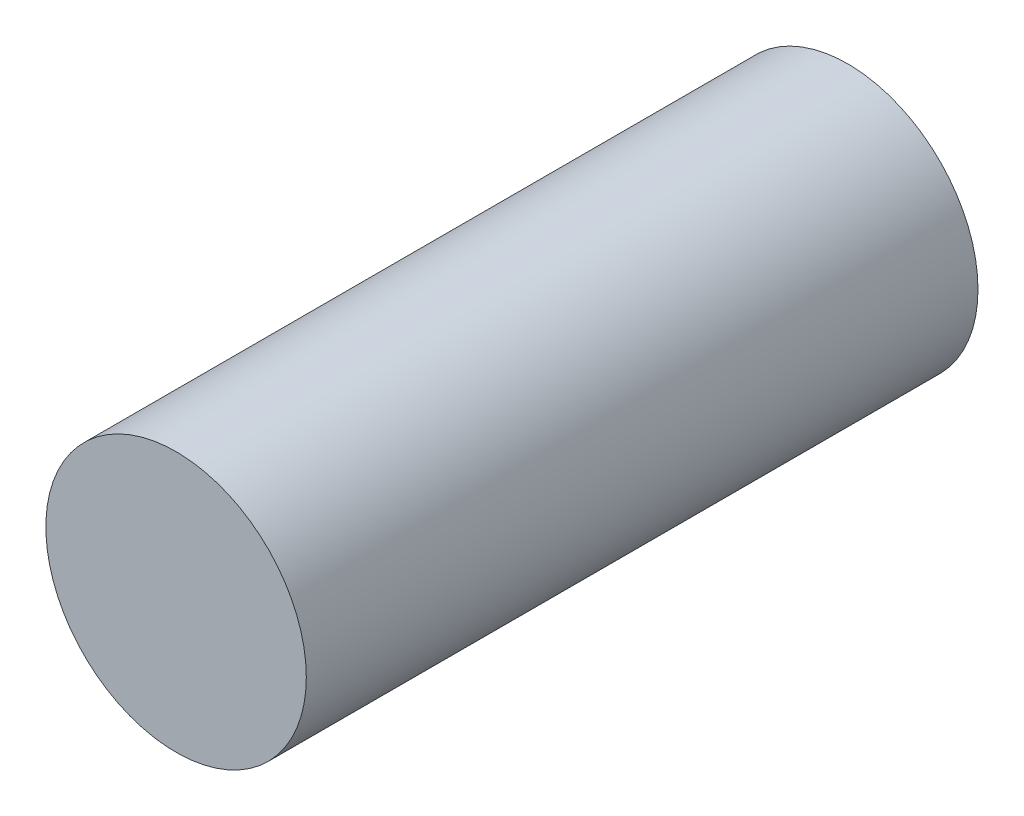
ISO-10303-21;
HEADER;
FILE_DESCRIPTION(('STEP AP214'),'2;1');
FILE_NAME('part.step','',(''),(''),'','','');
FILE_SCHEMA(('AUTOMOTIVE_DESIGN { 1 0 10303 214 1 1 1 1 }'));
ENDSEC;
DATA;
#1=APPLICATION_CONTEXT('core data for automotive mechanical design processes');
#2=APPLICATION_PROTOCOL_DEFINITION('international standard','automotive_design',2000,#1);
#3=PRODUCT_CONTEXT('',#1,'mechanical');
#4=PRODUCT('Part','Part','',(#3));
#5=PRODUCT_RELATED_PRODUCT_CATEGORY('part','',(#4));
#6=PRODUCT_DEFINITION_FORMATION('','',#4);
#7=PRODUCT_DEFINITION_CONTEXT('part definition',#1,'design');
#8=PRODUCT_DEFINITION('design','',#6,#7);
#9=PRODUCT_DEFINITION_SHAPE('','',#8);
#10=(LENGTH_UNIT() NAMED_UNIT(*) SI_UNIT(.MILLI.,.METRE.));
#11=(NAMED_UNIT(*) PLANE_ANGLE_UNIT() SI_UNIT($,.RADIAN.));
#12=(NAMED_UNIT(*) SI_UNIT($,.STERADIAN.) SOLID_ANGLE_UNIT());
#13=UNCERTAINTY_MEASURE_WITH_UNIT(LENGTH_MEASURE(1.E-05),#10,'distance_accuracy_value','');
#14=(GEOMETRIC_REPRESENTATION_CONTEXT(3) GLOBAL_UNCERTAINTY_ASSIGNED_CONTEXT((#13)) GLOBAL_UNIT_ASSIGNED_CONTEXT((#10,
#11,#12)) REPRESENTATION_CONTEXT('',''));
#15=CARTESIAN_POINT('',(0.,0.,0.));
#16=DIRECTION('',(0.,0.,1.));
#17=DIRECTION('',(1.,0.,0.));
#18=AXIS2_PLACEMENT_3D('',#15,#16,#17);
#19=CARTESIAN_POINT('',(0.,0.,98.));
#20=DIRECTION('',(0.,0.,-1.));
#21=DIRECTION('',(-1.,0.,0.));
#22=AXIS2_PLACEMENT_3D('',#19,#20,#21);
#23=CYLINDRICAL_SURFACE('',#22,19.);
#24=CARTESIAN_POINT('',(0.,0.,98.));
#25=DIRECTION('',(0.,0.,1.));
#26=DIRECTION('',(1.,0.,0.));
#27=AXIS2_PLACEMENT_3D('',#24,#25,#26);
#28=CIRCLE('',#27,19.);
#29=CARTESIAN_POINT('',(19.,0.,98.));
#30=VERTEX_POINT('',#29);
#31=EDGE_CURVE('E10',#30,#30,#28,.T.);
#32=ORIENTED_EDGE('',*,*,#31,.F.);
#33=EDGE_LOOP('',(#32));
#34=FACE_BOUND('',#33,.T.);
#35=CARTESIAN_POINT('',(0.,0.,0.));
#36=DIRECTION('',(0.,0.,1.));
#37=DIRECTION('',(1.,0.,0.));
#38=AXIS2_PLACEMENT_3D('',#35,#36,#37);
#39=CIRCLE('',#38,19.);
#40=CARTESIAN_POINT('',(19.,0.,0.));
#41=VERTEX_POINT('',#40);
#42=EDGE_CURVE('E46',#41,#41,#39,.T.);
#43=ORIENTED_EDGE('',*,*,#42,.T.);
#44=EDGE_LOOP('',(#43));
#45=FACE_BOUND('',#44,.T.);
#46=ADVANCED_FACE('F43',(#34,#45),#23,.T.);
#47=CARTESIAN_POINT('',(0.,0.,98.));
#48=DIRECTION('',(0.,0.,1.));
#49=DIRECTION('',(1.,0.,0.));
#50=AXIS2_PLACEMENT_3D('',#47,#48,#49);
#51=PLANE('',#50);
#52=ORIENTED_EDGE('',*,*,#31,.T.);
#53=EDGE_LOOP('',(#52));
#54=FACE_BOUND('',#53,.T.);
#55=ADVANCED_FACE('F60',(#54),#51,.T.);
#56=CARTESIAN_POINT('',(0.,0.,0.));
#57=DIRECTION('',(0.,0.,1.));
#58=DIRECTION('',(1.,0.,0.));
#59=AXIS2_PLACEMENT_3D('',#56,#57,#58);
#60=PLANE('',#59);
#61=ORIENTED_EDGE('',*,*,#42,.F.);
#62=EDGE_LOOP('',(#61));
#63=FACE_BOUND('',#62,.T.);
#64=ADVANCED_FACE('F58',(#63),#60,.F.);
#65=CLOSED_SHELL('',(#46,#55,#64));
#66=MANIFOLD_SOLID_BREP('B2',#65);
#67=ADVANCED_BREP_SHAPE_REPRESENTATION('',(#18,#66),#14);
#68=SHAPE_DEFINITION_REPRESENTATION(#9,#67);
ENDSEC;
END-ISO-10303-21;
